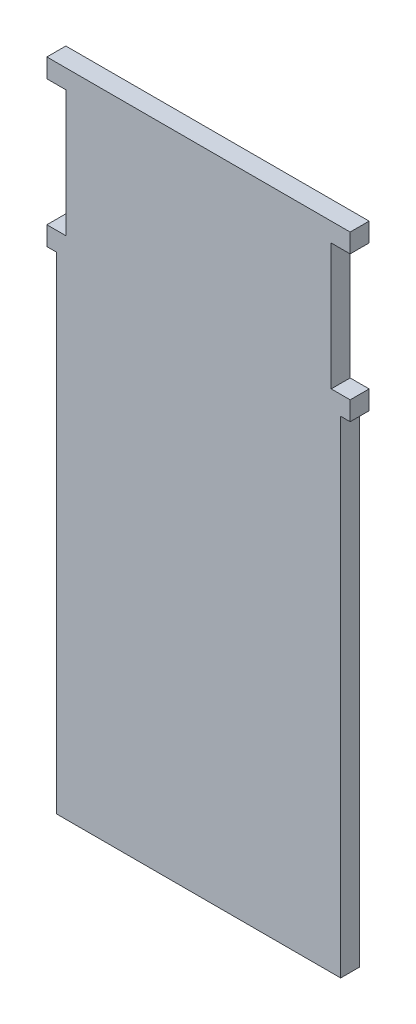
ISO-10303-21;
HEADER;
FILE_DESCRIPTION(('STEP AP214'),'2;1');
FILE_NAME('part.step','',(''),(''),'','','');
FILE_SCHEMA(('AUTOMOTIVE_DESIGN { 1 0 10303 214 1 1 1 1 }'));
ENDSEC;
DATA;
#1=APPLICATION_CONTEXT('core data for automotive mechanical design processes');
#2=APPLICATION_PROTOCOL_DEFINITION('international standard','automotive_design',2000,#1);
#3=PRODUCT_CONTEXT('',#1,'mechanical');
#4=PRODUCT('Part','Part','',(#3));
#5=PRODUCT_RELATED_PRODUCT_CATEGORY('part','',(#4));
#6=PRODUCT_DEFINITION_FORMATION('','',#4);
#7=PRODUCT_DEFINITION_CONTEXT('part definition',#1,'design');
#8=PRODUCT_DEFINITION('design','',#6,#7);
#9=PRODUCT_DEFINITION_SHAPE('','',#8);
#10=(LENGTH_UNIT() NAMED_UNIT(*) SI_UNIT(.MILLI.,.METRE.));
#11=(NAMED_UNIT(*) PLANE_ANGLE_UNIT() SI_UNIT($,.RADIAN.));
#12=(NAMED_UNIT(*) SI_UNIT($,.STERADIAN.) SOLID_ANGLE_UNIT());
#13=UNCERTAINTY_MEASURE_WITH_UNIT(LENGTH_MEASURE(1.E-05),#10,'distance_accuracy_value','');
#14=(GEOMETRIC_REPRESENTATION_CONTEXT(3) GLOBAL_UNCERTAINTY_ASSIGNED_CONTEXT((#13)) GLOBAL_UNIT_ASSIGNED_CONTEXT((#10,
#11,#12)) REPRESENTATION_CONTEXT('',''));
#15=CARTESIAN_POINT('',(0.,0.,0.));
#16=DIRECTION('',(0.,0.,1.));
#17=DIRECTION('',(1.,0.,0.));
#18=AXIS2_PLACEMENT_3D('',#15,#16,#17);
#19=CARTESIAN_POINT('',(-1.49999999999999,-26.,3.));
#20=DIRECTION('',(-1.,0.,0.));
#21=DIRECTION('',(0.,-1.,0.));
#22=AXIS2_PLACEMENT_3D('',#19,#20,#21);
#23=PLANE('',#22);
#24=DIRECTION('',(0.,1.,0.));
#25=VECTOR('',#24,1.);
#26=CARTESIAN_POINT('',(-1.49999999999999,-26.,0.));
#27=LINE('',#26,#25);
#28=CARTESIAN_POINT('',(-1.5,-103.,0.));
#29=VERTEX_POINT('',#28);
#30=CARTESIAN_POINT('',(-1.49999999999999,-26.,0.));
#31=VERTEX_POINT('',#30);
#32=EDGE_CURVE('E181',#29,#31,#27,.T.);
#33=ORIENTED_EDGE('',*,*,#32,.T.);
#34=DIRECTION('',(0.,0.,-1.));
#35=VECTOR('',#34,1.);
#36=CARTESIAN_POINT('',(-1.49999999999999,-26.,3.));
#37=LINE('',#36,#35);
#38=CARTESIAN_POINT('',(-1.49999999999999,-26.,3.));
#39=VERTEX_POINT('',#38);
#40=EDGE_CURVE('E11',#39,#31,#37,.T.);
#41=ORIENTED_EDGE('',*,*,#40,.F.);
#42=DIRECTION('',(0.,1.,0.));
#43=VECTOR('',#42,1.);
#44=CARTESIAN_POINT('',(-1.49999999999999,-26.,3.));
#45=LINE('',#44,#43);
#46=CARTESIAN_POINT('',(-1.5,-103.,3.));
#47=VERTEX_POINT('',#46);
#48=EDGE_CURVE('E211',#47,#39,#45,.T.);
#49=ORIENTED_EDGE('',*,*,#48,.F.);
#50=DIRECTION('',(0.,0.,-1.));
#51=VECTOR('',#50,1.);
#52=CARTESIAN_POINT('',(-1.5,-103.,3.));
#53=LINE('',#52,#51);
#54=EDGE_CURVE('E177',#47,#29,#53,.T.);
#55=ORIENTED_EDGE('',*,*,#54,.T.);
#56=EDGE_LOOP('',(#33,#41,#49,#55));
#57=FACE_BOUND('',#56,.T.);
#58=ADVANCED_FACE('F37',(#57),#23,.F.);
#59=CARTESIAN_POINT('',(-1.49999999999999,-26.,3.));
#60=DIRECTION('',(0.,1.,0.));
#61=DIRECTION('',(0.,0.,1.));
#62=AXIS2_PLACEMENT_3D('',#59,#60,#61);
#63=PLANE('',#62);
#64=DIRECTION('',(1.,0.,0.));
#65=VECTOR('',#64,1.);
#66=CARTESIAN_POINT('',(-1.49999999999999,-26.,0.));
#67=LINE('',#66,#65);
#68=CARTESIAN_POINT('',(0.,-26.,0.));
#69=VERTEX_POINT('',#68);
#70=EDGE_CURVE('E184',#31,#69,#67,.T.);
#71=ORIENTED_EDGE('',*,*,#70,.T.);
#72=DIRECTION('',(0.,0.,-1.));
#73=VECTOR('',#72,1.);
#74=CARTESIAN_POINT('',(0.,-26.,3.));
#75=LINE('',#74,#73);
#76=CARTESIAN_POINT('',(0.,-26.,3.));
#77=VERTEX_POINT('',#76);
#78=EDGE_CURVE('E45',#77,#69,#75,.T.);
#79=ORIENTED_EDGE('',*,*,#78,.F.);
#80=DIRECTION('',(1.,0.,0.));
#81=VECTOR('',#80,1.);
#82=CARTESIAN_POINT('',(-1.49999999999999,-26.,3.));
#83=LINE('',#82,#81);
#84=EDGE_CURVE('E120',#39,#77,#83,.T.);
#85=ORIENTED_EDGE('',*,*,#84,.F.);
#86=ORIENTED_EDGE('',*,*,#40,.T.);
#87=EDGE_LOOP('',(#71,#79,#85,#86));
#88=FACE_BOUND('',#87,.T.);
#89=ADVANCED_FACE('F309',(#88),#63,.F.);
#90=CARTESIAN_POINT('',(0.,-26.,3.));
#91=DIRECTION('',(-1.,0.,0.));
#92=DIRECTION('',(0.,0.,1.));
#93=AXIS2_PLACEMENT_3D('',#90,#91,#92);
#94=PLANE('',#93);
#95=DIRECTION('',(0.,1.,0.));
#96=VECTOR('',#95,1.);
#97=CARTESIAN_POINT('',(0.,-26.,0.));
#98=LINE('',#97,#96);
#99=CARTESIAN_POINT('',(0.,-23.,0.));
#100=VERTEX_POINT('',#99);
#101=EDGE_CURVE('E186',#69,#100,#98,.T.);
#102=ORIENTED_EDGE('',*,*,#101,.T.);
#103=DIRECTION('',(0.,0.,-1.));
#104=VECTOR('',#103,1.);
#105=CARTESIAN_POINT('',(0.,-23.,3.));
#106=LINE('',#105,#104);
#107=CARTESIAN_POINT('',(0.,-23.,3.));
#108=VERTEX_POINT('',#107);
#109=EDGE_CURVE('E242',#108,#100,#106,.T.);
#110=ORIENTED_EDGE('',*,*,#109,.F.);
#111=DIRECTION('',(0.,1.,0.));
#112=VECTOR('',#111,1.);
#113=CARTESIAN_POINT('',(0.,-26.,3.));
#114=LINE('',#113,#112);
#115=EDGE_CURVE('E250',#77,#108,#114,.T.);
#116=ORIENTED_EDGE('',*,*,#115,.F.);
#117=ORIENTED_EDGE('',*,*,#78,.T.);
#118=EDGE_LOOP('',(#102,#110,#116,#117));
#119=FACE_BOUND('',#118,.T.);
#120=ADVANCED_FACE('F248',(#119),#94,.F.);
#121=CARTESIAN_POINT('',(0.,-23.,3.));
#122=DIRECTION('',(0.,-1.,0.));
#123=DIRECTION('',(0.,0.,-1.));
#124=AXIS2_PLACEMENT_3D('',#121,#122,#123);
#125=PLANE('',#124);
#126=DIRECTION('',(-1.,0.,0.));
#127=VECTOR('',#126,1.);
#128=CARTESIAN_POINT('',(0.,-23.,0.));
#129=LINE('',#128,#127);
#130=CARTESIAN_POINT('',(-3.,-23.,0.));
#131=VERTEX_POINT('',#130);
#132=EDGE_CURVE('E188',#100,#131,#129,.T.);
#133=ORIENTED_EDGE('',*,*,#132,.T.);
#134=DIRECTION('',(0.,0.,-1.));
#135=VECTOR('',#134,1.);
#136=CARTESIAN_POINT('',(-3.,-23.,3.));
#137=LINE('',#136,#135);
#138=CARTESIAN_POINT('',(-3.,-23.,3.));
#139=VERTEX_POINT('',#138);
#140=EDGE_CURVE('E239',#139,#131,#137,.T.);
#141=ORIENTED_EDGE('',*,*,#140,.F.);
#142=DIRECTION('',(-1.,0.,0.));
#143=VECTOR('',#142,1.);
#144=CARTESIAN_POINT('',(0.,-23.,3.));
#145=LINE('',#144,#143);
#146=EDGE_CURVE('E268',#108,#139,#145,.T.);
#147=ORIENTED_EDGE('',*,*,#146,.F.);
#148=ORIENTED_EDGE('',*,*,#109,.T.);
#149=EDGE_LOOP('',(#133,#141,#147,#148));
#150=FACE_BOUND('',#149,.T.);
#151=ADVANCED_FACE('F259',(#150),#125,.F.);
#152=CARTESIAN_POINT('',(-3.,-23.,3.));
#153=DIRECTION('',(-1.,0.,0.));
#154=DIRECTION('',(0.,0.,1.));
#155=AXIS2_PLACEMENT_3D('',#152,#153,#154);
#156=PLANE('',#155);
#157=DIRECTION('',(0.,1.,0.));
#158=VECTOR('',#157,1.);
#159=CARTESIAN_POINT('',(-3.,-23.,0.));
#160=LINE('',#159,#158);
#161=CARTESIAN_POINT('',(-3.,-3.,0.));
#162=VERTEX_POINT('',#161);
#163=EDGE_CURVE('E190',#131,#162,#160,.T.);
#164=ORIENTED_EDGE('',*,*,#163,.T.);
#165=DIRECTION('',(0.,0.,-1.));
#166=VECTOR('',#165,1.);
#167=CARTESIAN_POINT('',(-3.,-3.,3.));
#168=LINE('',#167,#166);
#169=CARTESIAN_POINT('',(-3.,-3.,3.));
#170=VERTEX_POINT('',#169);
#171=EDGE_CURVE('E236',#170,#162,#168,.T.);
#172=ORIENTED_EDGE('',*,*,#171,.F.);
#173=DIRECTION('',(0.,1.,0.));
#174=VECTOR('',#173,1.);
#175=CARTESIAN_POINT('',(-3.,-23.,3.));
#176=LINE('',#175,#174);
#177=EDGE_CURVE('E265',#139,#170,#176,.T.);
#178=ORIENTED_EDGE('',*,*,#177,.F.);
#179=ORIENTED_EDGE('',*,*,#140,.T.);
#180=EDGE_LOOP('',(#164,#172,#178,#179));
#181=FACE_BOUND('',#180,.T.);
#182=ADVANCED_FACE('F263',(#181),#156,.F.);
#183=CARTESIAN_POINT('',(-3.,-3.,3.));
#184=DIRECTION('',(0.,1.,0.));
#185=DIRECTION('',(0.,0.,1.));
#186=AXIS2_PLACEMENT_3D('',#183,#184,#185);
#187=PLANE('',#186);
#188=DIRECTION('',(1.,0.,0.));
#189=VECTOR('',#188,1.);
#190=CARTESIAN_POINT('',(-3.,-3.,0.));
#191=LINE('',#190,#189);
#192=CARTESIAN_POINT('',(0.,-3.,0.));
#193=VERTEX_POINT('',#192);
#194=EDGE_CURVE('E192',#162,#193,#191,.T.);
#195=ORIENTED_EDGE('',*,*,#194,.T.);
#196=DIRECTION('',(0.,0.,-1.));
#197=VECTOR('',#196,1.);
#198=CARTESIAN_POINT('',(0.,-3.,3.));
#199=LINE('',#198,#197);
#200=CARTESIAN_POINT('',(0.,-3.,3.));
#201=VERTEX_POINT('',#200);
#202=EDGE_CURVE('E233',#201,#193,#199,.T.);
#203=ORIENTED_EDGE('',*,*,#202,.F.);
#204=DIRECTION('',(1.,0.,0.));
#205=VECTOR('',#204,1.);
#206=CARTESIAN_POINT('',(-3.,-3.,3.));
#207=LINE('',#206,#205);
#208=EDGE_CURVE('E267',#170,#201,#207,.T.);
#209=ORIENTED_EDGE('',*,*,#208,.F.);
#210=ORIENTED_EDGE('',*,*,#171,.T.);
#211=EDGE_LOOP('',(#195,#203,#209,#210));
#212=FACE_BOUND('',#211,.T.);
#213=ADVANCED_FACE('F322',(#212),#187,.F.);
#214=CARTESIAN_POINT('',(0.,-3.,3.));
#215=DIRECTION('',(-1.,0.,0.));
#216=DIRECTION('',(0.,0.,1.));
#217=AXIS2_PLACEMENT_3D('',#214,#215,#216);
#218=PLANE('',#217);
#219=DIRECTION('',(0.,1.,0.));
#220=VECTOR('',#219,1.);
#221=CARTESIAN_POINT('',(0.,-3.,0.));
#222=LINE('',#221,#220);
#223=CARTESIAN_POINT('',(0.,0.,0.));
#224=VERTEX_POINT('',#223);
#225=EDGE_CURVE('E194',#193,#224,#222,.T.);
#226=ORIENTED_EDGE('',*,*,#225,.T.);
#227=DIRECTION('',(0.,0.,-1.));
#228=VECTOR('',#227,1.);
#229=CARTESIAN_POINT('',(0.,0.,3.));
#230=LINE('',#229,#228);
#231=CARTESIAN_POINT('',(0.,0.,3.));
#232=VERTEX_POINT('',#231);
#233=EDGE_CURVE('E230',#232,#224,#230,.T.);
#234=ORIENTED_EDGE('',*,*,#233,.F.);
#235=DIRECTION('',(0.,1.,0.));
#236=VECTOR('',#235,1.);
#237=CARTESIAN_POINT('',(0.,-3.,3.));
#238=LINE('',#237,#236);
#239=EDGE_CURVE('E270',#201,#232,#238,.T.);
#240=ORIENTED_EDGE('',*,*,#239,.F.);
#241=ORIENTED_EDGE('',*,*,#202,.T.);
#242=EDGE_LOOP('',(#226,#234,#240,#241));
#243=FACE_BOUND('',#242,.T.);
#244=ADVANCED_FACE('F325',(#243),#218,.F.);
#245=CARTESIAN_POINT('',(0.,0.,3.));
#246=DIRECTION('',(0.,-1.,0.));
#247=DIRECTION('',(0.,0.,-1.));
#248=AXIS2_PLACEMENT_3D('',#245,#246,#247);
#249=PLANE('',#248);
#250=DIRECTION('',(-1.,0.,0.));
#251=VECTOR('',#250,1.);
#252=CARTESIAN_POINT('',(0.,0.,0.));
#253=LINE('',#252,#251);
#254=CARTESIAN_POINT('',(-48.,0.,0.));
#255=VERTEX_POINT('',#254);
#256=EDGE_CURVE('E196',#224,#255,#253,.T.);
#257=ORIENTED_EDGE('',*,*,#256,.T.);
#258=DIRECTION('',(0.,0.,-1.));
#259=VECTOR('',#258,1.);
#260=CARTESIAN_POINT('',(-48.,0.,3.));
#261=LINE('',#260,#259);
#262=CARTESIAN_POINT('',(-48.,0.,3.));
#263=VERTEX_POINT('',#262);
#264=EDGE_CURVE('E227',#263,#255,#261,.T.);
#265=ORIENTED_EDGE('',*,*,#264,.F.);
#266=DIRECTION('',(-1.,0.,0.));
#267=VECTOR('',#266,1.);
#268=CARTESIAN_POINT('',(0.,0.,3.));
#269=LINE('',#268,#267);
#270=EDGE_CURVE('E276',#232,#263,#269,.T.);
#271=ORIENTED_EDGE('',*,*,#270,.F.);
#272=ORIENTED_EDGE('',*,*,#233,.T.);
#273=EDGE_LOOP('',(#257,#265,#271,#272));
#274=FACE_BOUND('',#273,.T.);
#275=ADVANCED_FACE('F329',(#274),#249,.F.);
#276=CARTESIAN_POINT('',(-48.,-3.,3.));
#277=DIRECTION('',(1.,0.,0.));
#278=DIRECTION('',(0.,0.,-1.));
#279=AXIS2_PLACEMENT_3D('',#276,#277,#278);
#280=PLANE('',#279);
#281=DIRECTION('',(0.,-1.,0.));
#282=VECTOR('',#281,1.);
#283=CARTESIAN_POINT('',(-48.,-3.,0.));
#284=LINE('',#283,#282);
#285=CARTESIAN_POINT('',(-48.,-3.,0.));
#286=VERTEX_POINT('',#285);
#287=EDGE_CURVE('E198',#255,#286,#284,.T.);
#288=ORIENTED_EDGE('',*,*,#287,.T.);
#289=DIRECTION('',(0.,0.,-1.));
#290=VECTOR('',#289,1.);
#291=CARTESIAN_POINT('',(-48.,-3.,3.));
#292=LINE('',#291,#290);
#293=CARTESIAN_POINT('',(-48.,-3.,3.));
#294=VERTEX_POINT('',#293);
#295=EDGE_CURVE('E224',#294,#286,#292,.T.);
#296=ORIENTED_EDGE('',*,*,#295,.F.);
#297=DIRECTION('',(0.,-1.,0.));
#298=VECTOR('',#297,1.);
#299=CARTESIAN_POINT('',(-48.,-3.,3.));
#300=LINE('',#299,#298);
#301=EDGE_CURVE('E278',#263,#294,#300,.T.);
#302=ORIENTED_EDGE('',*,*,#301,.F.);
#303=ORIENTED_EDGE('',*,*,#264,.T.);
#304=EDGE_LOOP('',(#288,#296,#302,#303));
#305=FACE_BOUND('',#304,.T.);
#306=ADVANCED_FACE('F333',(#305),#280,.F.);
#307=CARTESIAN_POINT('',(-45.,-3.,3.));
#308=DIRECTION('',(0.,1.,0.));
#309=DIRECTION('',(0.,0.,1.));
#310=AXIS2_PLACEMENT_3D('',#307,#308,#309);
#311=PLANE('',#310);
#312=DIRECTION('',(1.,0.,0.));
#313=VECTOR('',#312,1.);
#314=CARTESIAN_POINT('',(-45.,-3.,0.));
#315=LINE('',#314,#313);
#316=CARTESIAN_POINT('',(-45.,-3.,0.));
#317=VERTEX_POINT('',#316);
#318=EDGE_CURVE('E200',#286,#317,#315,.T.);
#319=ORIENTED_EDGE('',*,*,#318,.T.);
#320=DIRECTION('',(0.,0.,-1.));
#321=VECTOR('',#320,1.);
#322=CARTESIAN_POINT('',(-45.,-3.,3.));
#323=LINE('',#322,#321);
#324=CARTESIAN_POINT('',(-45.,-3.,3.));
#325=VERTEX_POINT('',#324);
#326=EDGE_CURVE('E221',#325,#317,#323,.T.);
#327=ORIENTED_EDGE('',*,*,#326,.F.);
#328=DIRECTION('',(1.,0.,0.));
#329=VECTOR('',#328,1.);
#330=CARTESIAN_POINT('',(-45.,-3.,3.));
#331=LINE('',#330,#329);
#332=EDGE_CURVE('E280',#294,#325,#331,.T.);
#333=ORIENTED_EDGE('',*,*,#332,.F.);
#334=ORIENTED_EDGE('',*,*,#295,.T.);
#335=EDGE_LOOP('',(#319,#327,#333,#334));
#336=FACE_BOUND('',#335,.T.);
#337=ADVANCED_FACE('F337',(#336),#311,.F.);
#338=CARTESIAN_POINT('',(-45.,-23.,3.));
#339=DIRECTION('',(1.,0.,0.));
#340=DIRECTION('',(0.,0.,-1.));
#341=AXIS2_PLACEMENT_3D('',#338,#339,#340);
#342=PLANE('',#341);
#343=DIRECTION('',(0.,-1.,0.));
#344=VECTOR('',#343,1.);
#345=CARTESIAN_POINT('',(-45.,-23.,0.));
#346=LINE('',#345,#344);
#347=CARTESIAN_POINT('',(-45.,-23.,0.));
#348=VERTEX_POINT('',#347);
#349=EDGE_CURVE('E202',#317,#348,#346,.T.);
#350=ORIENTED_EDGE('',*,*,#349,.T.);
#351=DIRECTION('',(0.,0.,-1.));
#352=VECTOR('',#351,1.);
#353=CARTESIAN_POINT('',(-45.,-23.,3.));
#354=LINE('',#353,#352);
#355=CARTESIAN_POINT('',(-45.,-23.,3.));
#356=VERTEX_POINT('',#355);
#357=EDGE_CURVE('E218',#356,#348,#354,.T.);
#358=ORIENTED_EDGE('',*,*,#357,.F.);
#359=DIRECTION('',(0.,-1.,0.));
#360=VECTOR('',#359,1.);
#361=CARTESIAN_POINT('',(-45.,-23.,3.));
#362=LINE('',#361,#360);
#363=EDGE_CURVE('E282',#325,#356,#362,.T.);
#364=ORIENTED_EDGE('',*,*,#363,.F.);
#365=ORIENTED_EDGE('',*,*,#326,.T.);
#366=EDGE_LOOP('',(#350,#358,#364,#365));
#367=FACE_BOUND('',#366,.T.);
#368=ADVANCED_FACE('F341',(#367),#342,.F.);
#369=CARTESIAN_POINT('',(-48.,-23.,3.));
#370=DIRECTION('',(0.,-1.,0.));
#371=DIRECTION('',(0.,0.,-1.));
#372=AXIS2_PLACEMENT_3D('',#369,#370,#371);
#373=PLANE('',#372);
#374=DIRECTION('',(-1.,0.,0.));
#375=VECTOR('',#374,1.);
#376=CARTESIAN_POINT('',(-48.,-23.,0.));
#377=LINE('',#376,#375);
#378=CARTESIAN_POINT('',(-48.,-23.,0.));
#379=VERTEX_POINT('',#378);
#380=EDGE_CURVE('E204',#348,#379,#377,.T.);
#381=ORIENTED_EDGE('',*,*,#380,.T.);
#382=DIRECTION('',(0.,0.,-1.));
#383=VECTOR('',#382,1.);
#384=CARTESIAN_POINT('',(-48.,-23.,3.));
#385=LINE('',#384,#383);
#386=CARTESIAN_POINT('',(-48.,-23.,3.));
#387=VERTEX_POINT('',#386);
#388=EDGE_CURVE('E215',#387,#379,#385,.T.);
#389=ORIENTED_EDGE('',*,*,#388,.F.);
#390=DIRECTION('',(-1.,0.,0.));
#391=VECTOR('',#390,1.);
#392=CARTESIAN_POINT('',(-48.,-23.,3.));
#393=LINE('',#392,#391);
#394=EDGE_CURVE('E284',#356,#387,#393,.T.);
#395=ORIENTED_EDGE('',*,*,#394,.F.);
#396=ORIENTED_EDGE('',*,*,#357,.T.);
#397=EDGE_LOOP('',(#381,#389,#395,#396));
#398=FACE_BOUND('',#397,.T.);
#399=ADVANCED_FACE('F290',(#398),#373,.F.);
#400=CARTESIAN_POINT('',(-48.,-26.,3.));
#401=DIRECTION('',(1.,0.,0.));
#402=DIRECTION('',(0.,0.,-1.));
#403=AXIS2_PLACEMENT_3D('',#400,#401,#402);
#404=PLANE('',#403);
#405=DIRECTION('',(0.,-1.,0.));
#406=VECTOR('',#405,1.);
#407=CARTESIAN_POINT('',(-48.,-26.,0.));
#408=LINE('',#407,#406);
#409=CARTESIAN_POINT('',(-48.,-26.,0.));
#410=VERTEX_POINT('',#409);
#411=EDGE_CURVE('E206',#379,#410,#408,.T.);
#412=ORIENTED_EDGE('',*,*,#411,.T.);
#413=DIRECTION('',(0.,0.,-1.));
#414=VECTOR('',#413,1.);
#415=CARTESIAN_POINT('',(-48.,-26.,3.));
#416=LINE('',#415,#414);
#417=CARTESIAN_POINT('',(-48.,-26.,3.));
#418=VERTEX_POINT('',#417);
#419=EDGE_CURVE('E172',#418,#410,#416,.T.);
#420=ORIENTED_EDGE('',*,*,#419,.F.);
#421=DIRECTION('',(0.,-1.,0.));
#422=VECTOR('',#421,1.);
#423=CARTESIAN_POINT('',(-48.,-26.,3.));
#424=LINE('',#423,#422);
#425=EDGE_CURVE('E163',#387,#418,#424,.T.);
#426=ORIENTED_EDGE('',*,*,#425,.F.);
#427=ORIENTED_EDGE('',*,*,#388,.T.);
#428=EDGE_LOOP('',(#412,#420,#426,#427));
#429=FACE_BOUND('',#428,.T.);
#430=ADVANCED_FACE('F294',(#429),#404,.F.);
#431=CARTESIAN_POINT('',(-46.5,-26.,3.));
#432=DIRECTION('',(0.,1.,0.));
#433=DIRECTION('',(0.,0.,1.));
#434=AXIS2_PLACEMENT_3D('',#431,#432,#433);
#435=PLANE('',#434);
#436=DIRECTION('',(1.,0.,0.));
#437=VECTOR('',#436,1.);
#438=CARTESIAN_POINT('',(-46.5,-26.,0.));
#439=LINE('',#438,#437);
#440=CARTESIAN_POINT('',(-46.5,-26.,0.));
#441=VERTEX_POINT('',#440);
#442=EDGE_CURVE('E171',#410,#441,#439,.T.);
#443=ORIENTED_EDGE('',*,*,#442,.T.);
#444=DIRECTION('',(0.,0.,-1.));
#445=VECTOR('',#444,1.);
#446=CARTESIAN_POINT('',(-46.5,-26.,3.));
#447=LINE('',#446,#445);
#448=CARTESIAN_POINT('',(-46.5,-26.,3.));
#449=VERTEX_POINT('',#448);
#450=EDGE_CURVE('E168',#449,#441,#447,.T.);
#451=ORIENTED_EDGE('',*,*,#450,.F.);
#452=DIRECTION('',(1.,0.,0.));
#453=VECTOR('',#452,1.);
#454=CARTESIAN_POINT('',(-46.5,-26.,3.));
#455=LINE('',#454,#453);
#456=EDGE_CURVE('E157',#418,#449,#455,.T.);
#457=ORIENTED_EDGE('',*,*,#456,.F.);
#458=ORIENTED_EDGE('',*,*,#419,.T.);
#459=EDGE_LOOP('',(#443,#451,#457,#458));
#460=FACE_BOUND('',#459,.T.);
#461=ADVANCED_FACE('F169',(#460),#435,.F.);
#462=CARTESIAN_POINT('',(-46.5,-26.,3.));
#463=DIRECTION('',(1.,0.,0.));
#464=DIRECTION('',(0.,1.,0.));
#465=AXIS2_PLACEMENT_3D('',#462,#463,#464);
#466=PLANE('',#465);
#467=DIRECTION('',(0.,-1.,0.));
#468=VECTOR('',#467,1.);
#469=CARTESIAN_POINT('',(-46.5,-26.,0.));
#470=LINE('',#469,#468);
#471=CARTESIAN_POINT('',(-46.5,-103.,0.));
#472=VERTEX_POINT('',#471);
#473=EDGE_CURVE('E106',#441,#472,#470,.T.);
#474=ORIENTED_EDGE('',*,*,#473,.T.);
#475=DIRECTION('',(0.,0.,-1.));
#476=VECTOR('',#475,1.);
#477=CARTESIAN_POINT('',(-46.5,-103.,3.));
#478=LINE('',#477,#476);
#479=CARTESIAN_POINT('',(-46.5,-103.,3.));
#480=VERTEX_POINT('',#479);
#481=EDGE_CURVE('E173',#480,#472,#478,.T.);
#482=ORIENTED_EDGE('',*,*,#481,.F.);
#483=DIRECTION('',(0.,-1.,0.));
#484=VECTOR('',#483,1.);
#485=CARTESIAN_POINT('',(-46.5,-26.,3.));
#486=LINE('',#485,#484);
#487=EDGE_CURVE('E161',#449,#480,#486,.T.);
#488=ORIENTED_EDGE('',*,*,#487,.F.);
#489=ORIENTED_EDGE('',*,*,#450,.T.);
#490=EDGE_LOOP('',(#474,#482,#488,#489));
#491=FACE_BOUND('',#490,.T.);
#492=ADVANCED_FACE('F175',(#491),#466,.F.);
#493=CARTESIAN_POINT('',(-46.5,-103.,3.));
#494=DIRECTION('',(0.,1.,0.));
#495=DIRECTION('',(0.,0.,1.));
#496=AXIS2_PLACEMENT_3D('',#493,#494,#495);
#497=PLANE('',#496);
#498=DIRECTION('',(1.,0.,0.));
#499=VECTOR('',#498,1.);
#500=CARTESIAN_POINT('',(-46.5,-103.,0.));
#501=LINE('',#500,#499);
#502=EDGE_CURVE('E112',#472,#29,#501,.T.);
#503=ORIENTED_EDGE('',*,*,#502,.T.);
#504=ORIENTED_EDGE('',*,*,#54,.F.);
#505=DIRECTION('',(1.,0.,0.));
#506=VECTOR('',#505,1.);
#507=CARTESIAN_POINT('',(-46.5,-103.,3.));
#508=LINE('',#507,#506);
#509=EDGE_CURVE('E53',#480,#47,#508,.T.);
#510=ORIENTED_EDGE('',*,*,#509,.F.);
#511=ORIENTED_EDGE('',*,*,#481,.T.);
#512=EDGE_LOOP('',(#503,#504,#510,#511));
#513=FACE_BOUND('',#512,.T.);
#514=ADVANCED_FACE('F298',(#513),#497,.F.);
#515=CARTESIAN_POINT('',(-1.50000000000002,-103.,3.));
#516=DIRECTION('',(0.,0.,1.));
#517=DIRECTION('',(1.,0.,0.));
#518=AXIS2_PLACEMENT_3D('',#515,#516,#517);
#519=PLANE('',#518);
#520=ORIENTED_EDGE('',*,*,#48,.T.);
#521=ORIENTED_EDGE('',*,*,#84,.T.);
#522=ORIENTED_EDGE('',*,*,#115,.T.);
#523=ORIENTED_EDGE('',*,*,#146,.T.);
#524=ORIENTED_EDGE('',*,*,#177,.T.);
#525=ORIENTED_EDGE('',*,*,#208,.T.);
#526=ORIENTED_EDGE('',*,*,#239,.T.);
#527=ORIENTED_EDGE('',*,*,#270,.T.);
#528=ORIENTED_EDGE('',*,*,#301,.T.);
#529=ORIENTED_EDGE('',*,*,#332,.T.);
#530=ORIENTED_EDGE('',*,*,#363,.T.);
#531=ORIENTED_EDGE('',*,*,#394,.T.);
#532=ORIENTED_EDGE('',*,*,#425,.T.);
#533=ORIENTED_EDGE('',*,*,#456,.T.);
#534=ORIENTED_EDGE('',*,*,#487,.T.);
#535=ORIENTED_EDGE('',*,*,#509,.T.);
#536=EDGE_LOOP('',(#520,#521,#522,#523,#524,#525,#526,#527,#528,#529,#530,#531,#532,#533,#534,#535));
#537=FACE_BOUND('',#536,.T.);
#538=ADVANCED_FACE('F159',(#537),#519,.T.);
#539=CARTESIAN_POINT('',(-1.50000000000002,-103.,0.));
#540=DIRECTION('',(0.,0.,1.));
#541=DIRECTION('',(1.,0.,0.));
#542=AXIS2_PLACEMENT_3D('',#539,#540,#541);
#543=PLANE('',#542);
#544=ORIENTED_EDGE('',*,*,#32,.F.);
#545=ORIENTED_EDGE('',*,*,#502,.F.);
#546=ORIENTED_EDGE('',*,*,#473,.F.);
#547=ORIENTED_EDGE('',*,*,#442,.F.);
#548=ORIENTED_EDGE('',*,*,#411,.F.);
#549=ORIENTED_EDGE('',*,*,#380,.F.);
#550=ORIENTED_EDGE('',*,*,#349,.F.);
#551=ORIENTED_EDGE('',*,*,#318,.F.);
#552=ORIENTED_EDGE('',*,*,#287,.F.);
#553=ORIENTED_EDGE('',*,*,#256,.F.);
#554=ORIENTED_EDGE('',*,*,#225,.F.);
#555=ORIENTED_EDGE('',*,*,#194,.F.);
#556=ORIENTED_EDGE('',*,*,#163,.F.);
#557=ORIENTED_EDGE('',*,*,#132,.F.);
#558=ORIENTED_EDGE('',*,*,#101,.F.);
#559=ORIENTED_EDGE('',*,*,#70,.F.);
#560=EDGE_LOOP('',(#544,#545,#546,#547,#548,#549,#550,#551,#552,#553,#554,#555,#556,#557,#558,#559));
#561=FACE_BOUND('',#560,.T.);
#562=ADVANCED_FACE('F254',(#561),#543,.F.);
#563=CLOSED_SHELL('',(#58,#89,#120,#151,#182,#213,#244,#275,#306,#337,#368,#399,#430,#461,#492,
#514,#538,#562));
#564=MANIFOLD_SOLID_BREP('B2',#563);
#565=ADVANCED_BREP_SHAPE_REPRESENTATION('',(#18,#564),#14);
#566=SHAPE_DEFINITION_REPRESENTATION(#9,#565);
ENDSEC;
END-ISO-10303-21;
